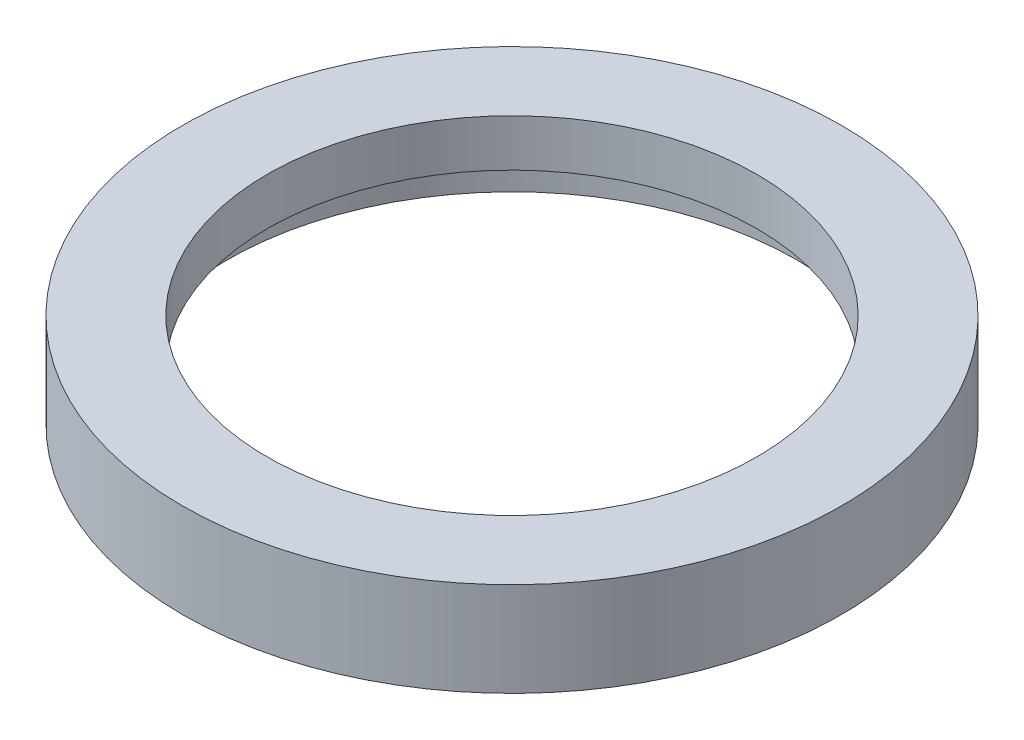
ISO-10303-21;
HEADER;
FILE_DESCRIPTION(('STEP AP214'),'2;1');
FILE_NAME('part.step','',(''),(''),'','','');
FILE_SCHEMA(('AUTOMOTIVE_DESIGN { 1 0 10303 214 1 1 1 1 }'));
ENDSEC;
DATA;
#1=APPLICATION_CONTEXT('core data for automotive mechanical design processes');
#2=APPLICATION_PROTOCOL_DEFINITION('international standard','automotive_design',2000,#1);
#3=PRODUCT_CONTEXT('',#1,'mechanical');
#4=PRODUCT('Part','Part','',(#3));
#5=PRODUCT_RELATED_PRODUCT_CATEGORY('part','',(#4));
#6=PRODUCT_DEFINITION_FORMATION('','',#4);
#7=PRODUCT_DEFINITION_CONTEXT('part definition',#1,'design');
#8=PRODUCT_DEFINITION('design','',#6,#7);
#9=PRODUCT_DEFINITION_SHAPE('','',#8);
#10=(LENGTH_UNIT() NAMED_UNIT(*) SI_UNIT(.MILLI.,.METRE.));
#11=(NAMED_UNIT(*) PLANE_ANGLE_UNIT() SI_UNIT($,.RADIAN.));
#12=(NAMED_UNIT(*) SI_UNIT($,.STERADIAN.) SOLID_ANGLE_UNIT());
#13=UNCERTAINTY_MEASURE_WITH_UNIT(LENGTH_MEASURE(1.E-05),#10,'distance_accuracy_value','');
#14=(GEOMETRIC_REPRESENTATION_CONTEXT(3) GLOBAL_UNCERTAINTY_ASSIGNED_CONTEXT((#13)) GLOBAL_UNIT_ASSIGNED_CONTEXT((#10,
#11,#12)) REPRESENTATION_CONTEXT('',''));
#15=CARTESIAN_POINT('',(0.,0.,0.));
#16=DIRECTION('',(0.,0.,1.));
#17=DIRECTION('',(1.,0.,0.));
#18=AXIS2_PLACEMENT_3D('',#15,#16,#17);
#19=CARTESIAN_POINT('',(0.,0.,0.));
#20=DIRECTION('',(0.,-1.,0.));
#21=DIRECTION('',(0.,0.,-1.));
#22=AXIS2_PLACEMENT_3D('',#19,#20,#21);
#23=CYLINDRICAL_SURFACE('',#22,35.);
#24=CARTESIAN_POINT('',(0.,5.,0.));
#25=DIRECTION('',(0.,-1.,0.));
#26=DIRECTION('',(0.,0.,-1.));
#27=AXIS2_PLACEMENT_3D('',#24,#25,#26);
#28=CIRCLE('',#27,35.);
#29=CARTESIAN_POINT('',(0.,5.,-35.));
#30=VERTEX_POINT('',#29);
#31=EDGE_CURVE('E60',#30,#30,#28,.T.);
#32=ORIENTED_EDGE('',*,*,#31,.T.);
#33=EDGE_LOOP('',(#32));
#34=FACE_BOUND('',#33,.T.);
#35=CARTESIAN_POINT('',(0.,-5.,0.));
#36=DIRECTION('',(0.,-1.,0.));
#37=DIRECTION('',(0.,0.,-1.));
#38=AXIS2_PLACEMENT_3D('',#35,#36,#37);
#39=CIRCLE('',#38,35.);
#40=CARTESIAN_POINT('',(0.,-5.,-35.));
#41=VERTEX_POINT('',#40);
#42=EDGE_CURVE('E10',#41,#41,#39,.T.);
#43=ORIENTED_EDGE('',*,*,#42,.F.);
#44=EDGE_LOOP('',(#43));
#45=FACE_BOUND('',#44,.T.);
#46=ADVANCED_FACE('F38',(#34,#45),#23,.T.);
#47=CARTESIAN_POINT('',(0.,-5.,0.));
#48=DIRECTION('',(0.,1.,0.));
#49=DIRECTION('',(0.,0.,1.));
#50=AXIS2_PLACEMENT_3D('',#47,#48,#49);
#51=PLANE('',#50);
#52=CARTESIAN_POINT('',(0.,-5.,0.));
#53=DIRECTION('',(0.,-1.,0.));
#54=DIRECTION('',(0.,0.,-1.));
#55=AXIS2_PLACEMENT_3D('',#52,#53,#54);
#56=CIRCLE('',#55,30.25);
#57=CARTESIAN_POINT('',(0.,-5.,-30.25));
#58=VERTEX_POINT('',#57);
#59=EDGE_CURVE('E44',#58,#58,#56,.T.);
#60=ORIENTED_EDGE('',*,*,#59,.F.);
#61=EDGE_LOOP('',(#60));
#62=FACE_BOUND('',#61,.T.);
#63=ORIENTED_EDGE('',*,*,#42,.T.);
#64=EDGE_LOOP('',(#63));
#65=FACE_BOUND('',#64,.T.);
#66=ADVANCED_FACE('F86',(#62,#65),#51,.F.);
#67=CARTESIAN_POINT('',(0.,0.,0.));
#68=DIRECTION('',(0.,-1.,0.));
#69=DIRECTION('',(0.,0.,-1.));
#70=AXIS2_PLACEMENT_3D('',#67,#68,#69);
#71=CYLINDRICAL_SURFACE('',#70,30.25);
#72=ORIENTED_EDGE('',*,*,#59,.T.);
#73=EDGE_LOOP('',(#72));
#74=FACE_BOUND('',#73,.T.);
#75=CARTESIAN_POINT('',(0.,0.,0.));
#76=DIRECTION('',(0.,-1.,0.));
#77=DIRECTION('',(0.,0.,-1.));
#78=AXIS2_PLACEMENT_3D('',#75,#76,#77);
#79=CIRCLE('',#78,30.25);
#80=CARTESIAN_POINT('',(0.,0.,-30.25));
#81=VERTEX_POINT('',#80);
#82=EDGE_CURVE('E48',#81,#81,#79,.T.);
#83=ORIENTED_EDGE('',*,*,#82,.F.);
#84=EDGE_LOOP('',(#83));
#85=FACE_BOUND('',#84,.T.);
#86=ADVANCED_FACE('F80',(#74,#85),#71,.F.);
#87=CARTESIAN_POINT('',(0.,0.,0.));
#88=DIRECTION('',(0.,-1.,0.));
#89=DIRECTION('',(0.,0.,-1.));
#90=AXIS2_PLACEMENT_3D('',#87,#88,#89);
#91=PLANE('',#90);
#92=ORIENTED_EDGE('',*,*,#82,.T.);
#93=EDGE_LOOP('',(#92));
#94=FACE_BOUND('',#93,.T.);
#95=CARTESIAN_POINT('',(0.,0.,0.));
#96=DIRECTION('',(0.,-1.,0.));
#97=DIRECTION('',(0.,0.,-1.));
#98=AXIS2_PLACEMENT_3D('',#95,#96,#97);
#99=CIRCLE('',#98,26.);
#100=CARTESIAN_POINT('',(0.,0.,-26.));
#101=VERTEX_POINT('',#100);
#102=EDGE_CURVE('E52',#101,#101,#99,.T.);
#103=ORIENTED_EDGE('',*,*,#102,.F.);
#104=EDGE_LOOP('',(#103));
#105=FACE_BOUND('',#104,.T.);
#106=ADVANCED_FACE('F75',(#94,#105),#91,.T.);
#107=CARTESIAN_POINT('',(0.,0.,0.));
#108=DIRECTION('',(0.,-1.,0.));
#109=DIRECTION('',(0.,0.,-1.));
#110=AXIS2_PLACEMENT_3D('',#107,#108,#109);
#111=CYLINDRICAL_SURFACE('',#110,26.);
#112=CARTESIAN_POINT('',(0.,5.,0.));
#113=DIRECTION('',(0.,-1.,0.));
#114=DIRECTION('',(0.,0.,-1.));
#115=AXIS2_PLACEMENT_3D('',#112,#113,#114);
#116=CIRCLE('',#115,26.);
#117=CARTESIAN_POINT('',(0.,5.,-26.));
#118=VERTEX_POINT('',#117);
#119=EDGE_CURVE('E57',#118,#118,#116,.T.);
#120=ORIENTED_EDGE('',*,*,#119,.F.);
#121=EDGE_LOOP('',(#120));
#122=FACE_BOUND('',#121,.T.);
#123=ORIENTED_EDGE('',*,*,#102,.T.);
#124=EDGE_LOOP('',(#123));
#125=FACE_BOUND('',#124,.T.);
#126=ADVANCED_FACE('F69',(#122,#125),#111,.F.);
#127=CARTESIAN_POINT('',(0.,5.,0.));
#128=DIRECTION('',(0.,-1.,0.));
#129=DIRECTION('',(0.,0.,-1.));
#130=AXIS2_PLACEMENT_3D('',#127,#128,#129);
#131=PLANE('',#130);
#132=ORIENTED_EDGE('',*,*,#31,.F.);
#133=EDGE_LOOP('',(#132));
#134=FACE_BOUND('',#133,.T.);
#135=ORIENTED_EDGE('',*,*,#119,.T.);
#136=EDGE_LOOP('',(#135));
#137=FACE_BOUND('',#136,.T.);
#138=ADVANCED_FACE('F66',(#134,#137),#131,.F.);
#139=CLOSED_SHELL('',(#46,#66,#86,#106,#126,#138));
#140=MANIFOLD_SOLID_BREP('B2',#139);
#141=ADVANCED_BREP_SHAPE_REPRESENTATION('',(#18,#140),#14);
#142=SHAPE_DEFINITION_REPRESENTATION(#9,#141);
ENDSEC;
END-ISO-10303-21;
